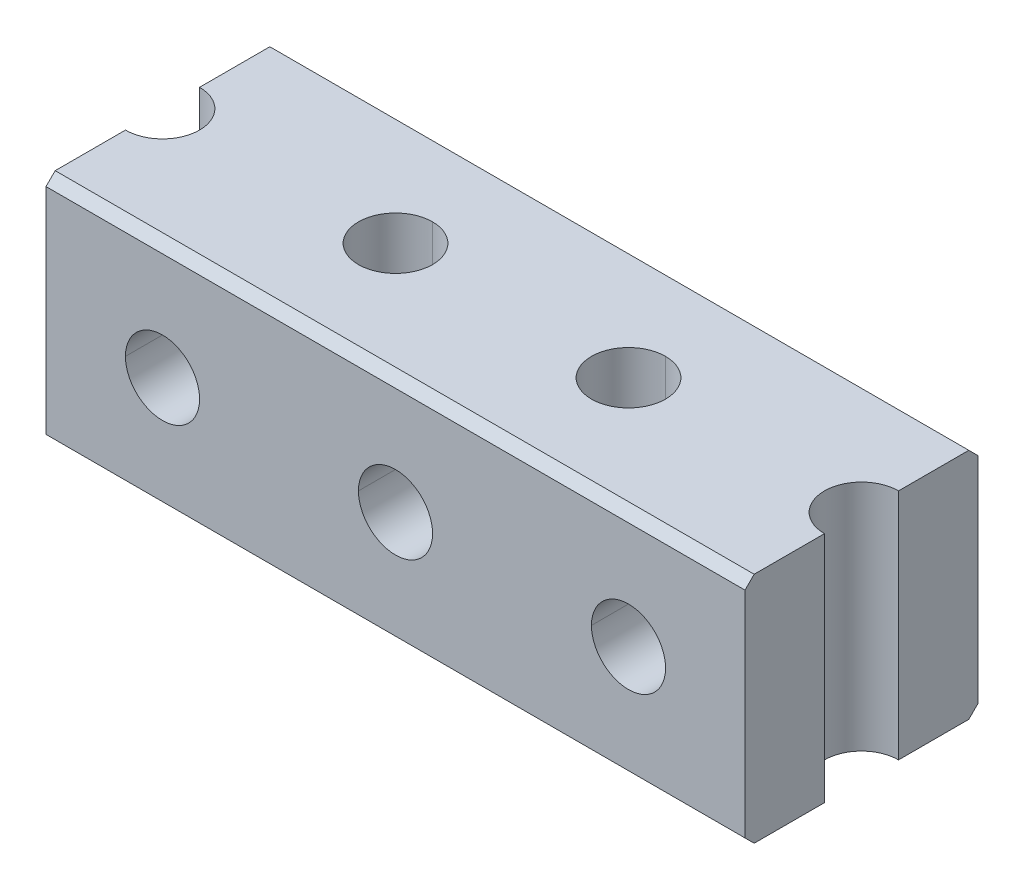
ISO-10303-21;
HEADER;
FILE_DESCRIPTION(('STEP AP214'),'2;1');
FILE_NAME('part.step','',(''),(''),'','','');
FILE_SCHEMA(('AUTOMOTIVE_DESIGN { 1 0 10303 214 1 1 1 1 }'));
ENDSEC;
DATA;
#1=APPLICATION_CONTEXT('core data for automotive mechanical design processes');
#2=APPLICATION_PROTOCOL_DEFINITION('international standard','automotive_design',2000,#1);
#3=PRODUCT_CONTEXT('',#1,'mechanical');
#4=PRODUCT('Part','Part','',(#3));
#5=PRODUCT_RELATED_PRODUCT_CATEGORY('part','',(#4));
#6=PRODUCT_DEFINITION_FORMATION('','',#4);
#7=PRODUCT_DEFINITION_CONTEXT('part definition',#1,'design');
#8=PRODUCT_DEFINITION('design','',#6,#7);
#9=PRODUCT_DEFINITION_SHAPE('','',#8);
#10=(LENGTH_UNIT() NAMED_UNIT(*) SI_UNIT(.MILLI.,.METRE.));
#11=(NAMED_UNIT(*) PLANE_ANGLE_UNIT() SI_UNIT($,.RADIAN.));
#12=(NAMED_UNIT(*) SI_UNIT($,.STERADIAN.) SOLID_ANGLE_UNIT());
#13=UNCERTAINTY_MEASURE_WITH_UNIT(LENGTH_MEASURE(1.E-05),#10,'distance_accuracy_value','');
#14=(GEOMETRIC_REPRESENTATION_CONTEXT(3) GLOBAL_UNCERTAINTY_ASSIGNED_CONTEXT((#13)) GLOBAL_UNIT_ASSIGNED_CONTEXT((#10,
#11,#12)) REPRESENTATION_CONTEXT('',''));
#15=CARTESIAN_POINT('',(0.,0.,0.));
#16=DIRECTION('',(0.,0.,1.));
#17=DIRECTION('',(1.,0.,0.));
#18=AXIS2_PLACEMENT_3D('',#15,#16,#17);
#19=CARTESIAN_POINT('',(-19.0500000000004,-6.3499999999999,1.11022302462516E-13));
#20=DIRECTION('',(1.,0.,0.));
#21=DIRECTION('',(0.,0.,-1.));
#22=AXIS2_PLACEMENT_3D('',#19,#20,#21);
#23=PLANE('',#22);
#24=DIRECTION('',(0.,-0.707106781186568,0.707106781186527));
#25=VECTOR('',#24,1.);
#26=CARTESIAN_POINT('',(-19.0500000000004,-5.85,-6.34999999999949));
#27=LINE('',#26,#25);
#28=CARTESIAN_POINT('',(-19.0500000000004,-5.85,-6.34999999999949));
#29=VERTEX_POINT('',#28);
#30=CARTESIAN_POINT('',(-19.0500000000004,-6.35,-5.84999999999952));
#31=VERTEX_POINT('',#30);
#32=EDGE_CURVE('E145',#29,#31,#27,.T.);
#33=ORIENTED_EDGE('',*,*,#32,.T.);
#34=DIRECTION('',(0.,0.,-1.));
#35=VECTOR('',#34,1.);
#36=CARTESIAN_POINT('',(-19.0500000000004,-6.3499999999999,1.11022302462516E-13));
#37=LINE('',#36,#35);
#38=CARTESIAN_POINT('',(-19.0500000000004,-6.3499999999999,-2.01929999999968));
#39=VERTEX_POINT('',#38);
#40=EDGE_CURVE('E167',#39,#31,#37,.T.);
#41=ORIENTED_EDGE('',*,*,#40,.F.);
#42=DIRECTION('',(0.,1.,0.));
#43=VECTOR('',#42,1.);
#44=CARTESIAN_POINT('',(-19.0500000000004,-6.3499999999999,-2.01929999999968));
#45=LINE('',#44,#43);
#46=CARTESIAN_POINT('',(-19.05,6.35000000000016,-2.01929999999981));
#47=VERTEX_POINT('',#46);
#48=EDGE_CURVE('E27',#39,#47,#45,.T.);
#49=ORIENTED_EDGE('',*,*,#48,.T.);
#50=DIRECTION('',(0.,0.,-1.));
#51=VECTOR('',#50,1.);
#52=CARTESIAN_POINT('',(-19.05,6.35000000000014,1.56125112837912E-13));
#53=LINE('',#52,#51);
#54=CARTESIAN_POINT('',(-19.05,6.35,-5.8499999999995));
#55=VERTEX_POINT('',#54);
#56=EDGE_CURVE('E221',#47,#55,#53,.T.);
#57=ORIENTED_EDGE('',*,*,#56,.T.);
#58=DIRECTION('',(0.,-0.707106781186568,-0.707106781186527));
#59=VECTOR('',#58,1.);
#60=CARTESIAN_POINT('',(-19.05,6.35,-5.8499999999995));
#61=LINE('',#60,#59);
#62=CARTESIAN_POINT('',(-19.0500000000002,5.85,-6.3499999999995));
#63=VERTEX_POINT('',#62);
#64=EDGE_CURVE('E250',#55,#63,#61,.T.);
#65=ORIENTED_EDGE('',*,*,#64,.T.);
#66=DIRECTION('',(0.,1.,0.));
#67=VECTOR('',#66,1.);
#68=CARTESIAN_POINT('',(-19.0500000000004,-6.35,-6.34999999999949));
#69=LINE('',#68,#67);
#70=EDGE_CURVE('E186',#29,#63,#69,.T.);
#71=ORIENTED_EDGE('',*,*,#70,.F.);
#72=EDGE_LOOP('',(#33,#41,#49,#57,#65,#71));
#73=FACE_BOUND('',#72,.T.);
#74=ADVANCED_FACE('F17',(#73),#23,.F.);
#75=CARTESIAN_POINT('',(19.05,-6.35000000000017,0.));
#76=DIRECTION('',(1.,0.,0.));
#77=DIRECTION('',(0.,0.,-1.));
#78=AXIS2_PLACEMENT_3D('',#75,#76,#77);
#79=PLANE('',#78);
#80=DIRECTION('',(0.,1.,0.));
#81=VECTOR('',#80,1.);
#82=CARTESIAN_POINT('',(19.05,-6.35000000000019,-6.34999999999954));
#83=LINE('',#82,#81);
#84=CARTESIAN_POINT('',(19.05,-5.85000000000016,-6.34999999999955));
#85=VERTEX_POINT('',#84);
#86=CARTESIAN_POINT('',(19.0500000000012,5.85000000000012,-6.34999999999965));
#87=VERTEX_POINT('',#86);
#88=EDGE_CURVE('E245',#85,#87,#83,.T.);
#89=ORIENTED_EDGE('',*,*,#88,.T.);
#90=DIRECTION('',(0.,-0.707106781186568,-0.707106781186527));
#91=VECTOR('',#90,1.);
#92=CARTESIAN_POINT('',(19.0500000000011,6.35000000000025,-5.84999999999972));
#93=LINE('',#92,#91);
#94=CARTESIAN_POINT('',(19.0500000000011,6.35000000000025,-5.84999999999972));
#95=VERTEX_POINT('',#94);
#96=EDGE_CURVE('E253',#95,#87,#93,.T.);
#97=ORIENTED_EDGE('',*,*,#96,.F.);
#98=DIRECTION('',(0.,0.,-1.));
#99=VECTOR('',#98,1.);
#100=CARTESIAN_POINT('',(19.0500000000011,6.35000000000025,1.17961196366423E-13));
#101=LINE('',#100,#99);
#102=CARTESIAN_POINT('',(19.0500000000011,6.35000000000027,-2.01929999999981));
#103=VERTEX_POINT('',#102);
#104=EDGE_CURVE('E140',#103,#95,#101,.T.);
#105=ORIENTED_EDGE('',*,*,#104,.F.);
#106=DIRECTION('',(0.,1.,0.));
#107=VECTOR('',#106,1.);
#108=CARTESIAN_POINT('',(19.05,-6.35000000000015,-2.01929999999983));
#109=LINE('',#108,#107);
#110=CARTESIAN_POINT('',(19.05,-6.35000000000015,-2.01929999999983));
#111=VERTEX_POINT('',#110);
#112=EDGE_CURVE('E130',#111,#103,#109,.T.);
#113=ORIENTED_EDGE('',*,*,#112,.F.);
#114=DIRECTION('',(0.,0.,-1.));
#115=VECTOR('',#114,1.);
#116=CARTESIAN_POINT('',(19.05,-6.35000000000017,0.));
#117=LINE('',#116,#115);
#118=CARTESIAN_POINT('',(19.05,-6.35000000000015,-5.84999999999971));
#119=VERTEX_POINT('',#118);
#120=EDGE_CURVE('E136',#111,#119,#117,.T.);
#121=ORIENTED_EDGE('',*,*,#120,.T.);
#122=DIRECTION('',(0.,-0.707106781186568,0.707106781186527));
#123=VECTOR('',#122,1.);
#124=CARTESIAN_POINT('',(19.05,-5.85000000000016,-6.34999999999955));
#125=LINE('',#124,#123);
#126=EDGE_CURVE('E224',#85,#119,#125,.T.);
#127=ORIENTED_EDGE('',*,*,#126,.F.);
#128=EDGE_LOOP('',(#89,#97,#105,#113,#121,#127));
#129=FACE_BOUND('',#128,.T.);
#130=ADVANCED_FACE('F133',(#129),#79,.T.);
#131=CARTESIAN_POINT('',(-19.0500000000004,-6.3499999999999,1.11022302462516E-13));
#132=DIRECTION('',(1.,0.,0.));
#133=DIRECTION('',(0.,0.,-1.));
#134=AXIS2_PLACEMENT_3D('',#131,#132,#133);
#135=PLANE('',#134);
#136=DIRECTION('',(0.,0.707106781186568,0.707106781186527));
#137=VECTOR('',#136,1.);
#138=CARTESIAN_POINT('',(-19.0500000000004,-6.34999999999993,5.85));
#139=LINE('',#138,#137);
#140=CARTESIAN_POINT('',(-19.0500000000004,-6.34999999999993,5.85));
#141=VERTEX_POINT('',#140);
#142=CARTESIAN_POINT('',(-19.0500000000004,-5.84999999999984,6.34999999999992));
#143=VERTEX_POINT('',#142);
#144=EDGE_CURVE('E41',#141,#143,#139,.T.);
#145=ORIENTED_EDGE('',*,*,#144,.T.);
#146=DIRECTION('',(0.,1.,0.));
#147=VECTOR('',#146,1.);
#148=CARTESIAN_POINT('',(-19.0500000000004,-6.34999999999987,6.34999999999992));
#149=LINE('',#148,#147);
#150=CARTESIAN_POINT('',(-19.0500000000002,5.85000000000026,6.35));
#151=VERTEX_POINT('',#150);
#152=EDGE_CURVE('E235',#143,#151,#149,.T.);
#153=ORIENTED_EDGE('',*,*,#152,.T.);
#154=DIRECTION('',(0.,0.707106781186568,-0.707106781186527));
#155=VECTOR('',#154,1.);
#156=CARTESIAN_POINT('',(-19.0500000000002,5.85000000000026,6.35));
#157=LINE('',#156,#155);
#158=CARTESIAN_POINT('',(-19.05,6.35000000000027,5.85));
#159=VERTEX_POINT('',#158);
#160=EDGE_CURVE('E198',#151,#159,#157,.T.);
#161=ORIENTED_EDGE('',*,*,#160,.T.);
#162=DIRECTION('',(0.,0.,-1.));
#163=VECTOR('',#162,1.);
#164=CARTESIAN_POINT('',(-19.05,6.35000000000014,1.56125112837912E-13));
#165=LINE('',#164,#163);
#166=CARTESIAN_POINT('',(-19.05,6.35000000000012,2.0193));
#167=VERTEX_POINT('',#166);
#168=EDGE_CURVE('E241',#159,#167,#165,.T.);
#169=ORIENTED_EDGE('',*,*,#168,.T.);
#170=DIRECTION('',(0.,1.,0.));
#171=VECTOR('',#170,1.);
#172=CARTESIAN_POINT('',(-19.0500000000004,-6.34999999999993,2.01930000000005));
#173=LINE('',#172,#171);
#174=CARTESIAN_POINT('',(-19.0500000000004,-6.34999999999993,2.01930000000005));
#175=VERTEX_POINT('',#174);
#176=EDGE_CURVE('E11',#175,#167,#173,.T.);
#177=ORIENTED_EDGE('',*,*,#176,.F.);
#178=DIRECTION('',(0.,0.,-1.));
#179=VECTOR('',#178,1.);
#180=CARTESIAN_POINT('',(-19.0500000000004,-6.3499999999999,1.11022302462516E-13));
#181=LINE('',#180,#179);
#182=EDGE_CURVE('E170',#141,#175,#181,.T.);
#183=ORIENTED_EDGE('',*,*,#182,.F.);
#184=EDGE_LOOP('',(#145,#153,#161,#169,#177,#183));
#185=FACE_BOUND('',#184,.T.);
#186=ADVANCED_FACE('F636',(#185),#135,.F.);
#187=CARTESIAN_POINT('',(19.05,-6.35000000000017,0.));
#188=DIRECTION('',(1.,0.,0.));
#189=DIRECTION('',(0.,0.,-1.));
#190=AXIS2_PLACEMENT_3D('',#187,#188,#189);
#191=PLANE('',#190);
#192=DIRECTION('',(0.,0.,-1.));
#193=VECTOR('',#192,1.);
#194=CARTESIAN_POINT('',(19.05,-6.35000000000017,0.));
#195=LINE('',#194,#193);
#196=CARTESIAN_POINT('',(19.05,-6.35000000000011,5.85));
#197=VERTEX_POINT('',#196);
#198=CARTESIAN_POINT('',(19.05,-6.35000000000018,2.01930000000003));
#199=VERTEX_POINT('',#198);
#200=EDGE_CURVE('E154',#197,#199,#195,.T.);
#201=ORIENTED_EDGE('',*,*,#200,.T.);
#202=DIRECTION('',(0.,1.,0.));
#203=VECTOR('',#202,1.);
#204=CARTESIAN_POINT('',(19.05,-6.35000000000018,2.01930000000003));
#205=LINE('',#204,#203);
#206=CARTESIAN_POINT('',(19.0500000000011,6.35000000000024,2.01929999999992));
#207=VERTEX_POINT('',#206);
#208=EDGE_CURVE('E146',#199,#207,#205,.T.);
#209=ORIENTED_EDGE('',*,*,#208,.T.);
#210=DIRECTION('',(0.,0.,-1.));
#211=VECTOR('',#210,1.);
#212=CARTESIAN_POINT('',(19.0500000000011,6.35000000000025,1.17961196366423E-13));
#213=LINE('',#212,#211);
#214=CARTESIAN_POINT('',(19.0500000000011,6.35000000000034,5.85));
#215=VERTEX_POINT('',#214);
#216=EDGE_CURVE('E332',#215,#207,#213,.T.);
#217=ORIENTED_EDGE('',*,*,#216,.F.);
#218=DIRECTION('',(0.,0.707106781186568,-0.707106781186527));
#219=VECTOR('',#218,1.);
#220=CARTESIAN_POINT('',(19.0500000000012,5.85000000000034,6.34999999999991));
#221=LINE('',#220,#219);
#222=CARTESIAN_POINT('',(19.0500000000012,5.85000000000034,6.34999999999991));
#223=VERTEX_POINT('',#222);
#224=EDGE_CURVE('E194',#223,#215,#221,.T.);
#225=ORIENTED_EDGE('',*,*,#224,.F.);
#226=DIRECTION('',(0.,1.,0.));
#227=VECTOR('',#226,1.);
#228=CARTESIAN_POINT('',(19.05,-6.35000000000007,6.35));
#229=LINE('',#228,#227);
#230=CARTESIAN_POINT('',(19.05,-5.85,6.34999999999992));
#231=VERTEX_POINT('',#230);
#232=EDGE_CURVE('E216',#231,#223,#229,.T.);
#233=ORIENTED_EDGE('',*,*,#232,.F.);
#234=DIRECTION('',(0.,0.707106781186568,0.707106781186527));
#235=VECTOR('',#234,1.);
#236=CARTESIAN_POINT('',(19.05,-6.35000000000011,5.85));
#237=LINE('',#236,#235);
#238=EDGE_CURVE('E55',#197,#231,#237,.T.);
#239=ORIENTED_EDGE('',*,*,#238,.F.);
#240=EDGE_LOOP('',(#201,#209,#217,#225,#233,#239));
#241=FACE_BOUND('',#240,.T.);
#242=ADVANCED_FACE('F19',(#241),#191,.T.);
#243=CARTESIAN_POINT('',(-19.05,6.35000000000014,1.56125112837912E-13));
#244=DIRECTION('',(0.,1.,0.));
#245=DIRECTION('',(0.,0.,1.));
#246=AXIS2_PLACEMENT_3D('',#243,#244,#245);
#247=CYLINDRICAL_SURFACE('',#246,2.01929999999991);
#248=CARTESIAN_POINT('',(-19.05,6.35000000000015,1.56125112837912E-13));
#249=DIRECTION('',(0.,1.,0.));
#250=DIRECTION('',(0.,0.,1.));
#251=AXIS2_PLACEMENT_3D('',#248,#249,#250);
#252=CIRCLE('',#251,2.0192999999999);
#253=EDGE_CURVE('E237',#167,#47,#252,.T.);
#254=ORIENTED_EDGE('',*,*,#253,.T.);
#255=ORIENTED_EDGE('',*,*,#48,.F.);
#256=CARTESIAN_POINT('',(-19.0500000000004,-6.3499999999999,1.11022302462516E-13));
#257=DIRECTION('',(0.,1.,0.));
#258=DIRECTION('',(0.,0.,1.));
#259=AXIS2_PLACEMENT_3D('',#256,#257,#258);
#260=CIRCLE('',#259,2.01929999999992);
#261=EDGE_CURVE('E178',#175,#39,#260,.T.);
#262=ORIENTED_EDGE('',*,*,#261,.F.);
#263=ORIENTED_EDGE('',*,*,#176,.T.);
#264=EDGE_LOOP('',(#254,#255,#262,#263));
#265=FACE_BOUND('',#264,.T.);
#266=ADVANCED_FACE('F428',(#265),#247,.F.);
#267=CARTESIAN_POINT('',(6.35000000000088,6.35000000000014,1.7347234759768E-13));
#268=DIRECTION('',(0.,1.,0.));
#269=DIRECTION('',(0.,0.,1.));
#270=AXIS2_PLACEMENT_3D('',#267,#268,#269);
#271=CYLINDRICAL_SURFACE('',#270,2.0192999999999);
#272=DIRECTION('',(0.,1.,0.));
#273=VECTOR('',#272,1.);
#274=CARTESIAN_POINT('',(6.35000000000088,6.35000000000014,-2.01929999999973));
#275=LINE('',#274,#273);
#276=CARTESIAN_POINT('',(6.35000000000088,-6.35000000000009,-2.01929999999991));
#277=VERTEX_POINT('',#276);
#278=CARTESIAN_POINT('',(6.35000000000088,6.35000000000014,-2.01929999999981));
#279=VERTEX_POINT('',#278);
#280=EDGE_CURVE('E206',#277,#279,#275,.T.);
#281=ORIENTED_EDGE('',*,*,#280,.F.);
#282=CARTESIAN_POINT('',(6.35,-6.35000000000009,0.));
#283=DIRECTION('',(0.,1.,0.));
#284=DIRECTION('',(0.,0.,1.));
#285=AXIS2_PLACEMENT_3D('',#282,#283,#284);
#286=CIRCLE('',#285,2.01929999999991);
#287=CARTESIAN_POINT('',(6.35,-6.35000000000009,2.0193));
#288=VERTEX_POINT('',#287);
#289=EDGE_CURVE('E274',#288,#277,#286,.T.);
#290=ORIENTED_EDGE('',*,*,#289,.F.);
#291=DIRECTION('',(0.,1.,0.));
#292=VECTOR('',#291,1.);
#293=CARTESIAN_POINT('',(6.35000000000088,6.35000000000014,2.01930000000008));
#294=LINE('',#293,#292);
#295=CARTESIAN_POINT('',(6.35000000000088,6.35000000000014,2.01930000000007));
#296=VERTEX_POINT('',#295);
#297=EDGE_CURVE('E205',#288,#296,#294,.T.);
#298=ORIENTED_EDGE('',*,*,#297,.T.);
#299=CARTESIAN_POINT('',(6.35000000000088,6.35000000000014,1.7347234759768E-13));
#300=DIRECTION('',(0.,1.,0.));
#301=DIRECTION('',(0.,0.,1.));
#302=AXIS2_PLACEMENT_3D('',#299,#300,#301);
#303=CIRCLE('',#302,2.0192999999999);
#304=EDGE_CURVE('E236',#296,#279,#303,.T.);
#305=ORIENTED_EDGE('',*,*,#304,.T.);
#306=EDGE_LOOP('',(#281,#290,#298,#305));
#307=FACE_BOUND('',#306,.T.);
#308=ADVANCED_FACE('F666',(#307),#271,.F.);
#309=CARTESIAN_POINT('',(-12.7000000000002,0.,6.34999999999992));
#310=DIRECTION('',(0.,0.,1.));
#311=DIRECTION('',(1.,0.,0.));
#312=AXIS2_PLACEMENT_3D('',#309,#310,#311);
#313=CYLINDRICAL_SURFACE('',#312,2.01930000000005);
#314=DIRECTION('',(0.,0.,1.));
#315=VECTOR('',#314,1.);
#316=CARTESIAN_POINT('',(-14.7193000000002,0.,6.34999999999992));
#317=LINE('',#316,#315);
#318=CARTESIAN_POINT('',(-14.7193000000002,0.,-6.34999999999955));
#319=VERTEX_POINT('',#318);
#320=CARTESIAN_POINT('',(-14.7193000000002,0.,6.34999999999992));
#321=VERTEX_POINT('',#320);
#322=EDGE_CURVE('E230',#319,#321,#317,.T.);
#323=ORIENTED_EDGE('',*,*,#322,.F.);
#324=CARTESIAN_POINT('',(-12.7000000000002,0.,-6.34999999999955));
#325=DIRECTION('',(0.,0.,1.));
#326=DIRECTION('',(1.,0.,0.));
#327=AXIS2_PLACEMENT_3D('',#324,#325,#326);
#328=CIRCLE('',#327,2.01930000000005);
#329=CARTESIAN_POINT('',(-10.6807,0.,-6.34999999999955));
#330=VERTEX_POINT('',#329);
#331=EDGE_CURVE('E177',#330,#319,#328,.T.);
#332=ORIENTED_EDGE('',*,*,#331,.F.);
#333=DIRECTION('',(0.,0.,1.));
#334=VECTOR('',#333,1.);
#335=CARTESIAN_POINT('',(-10.6807,0.,6.34999999999992));
#336=LINE('',#335,#334);
#337=CARTESIAN_POINT('',(-10.6807,0.,6.34999999999992));
#338=VERTEX_POINT('',#337);
#339=EDGE_CURVE('E229',#330,#338,#336,.T.);
#340=ORIENTED_EDGE('',*,*,#339,.T.);
#341=CARTESIAN_POINT('',(-12.7000000000002,0.,6.34999999999992));
#342=DIRECTION('',(0.,0.,1.));
#343=DIRECTION('',(1.,0.,0.));
#344=AXIS2_PLACEMENT_3D('',#341,#342,#343);
#345=CIRCLE('',#344,2.01930000000005);
#346=EDGE_CURVE('E180',#338,#321,#345,.T.);
#347=ORIENTED_EDGE('',*,*,#346,.T.);
#348=EDGE_LOOP('',(#323,#332,#340,#347));
#349=FACE_BOUND('',#348,.T.);
#350=ADVANCED_FACE('F318',(#349),#313,.F.);
#351=CARTESIAN_POINT('',(12.7000000000003,1.93421667571414E-13,6.35));
#352=DIRECTION('',(0.,0.,1.));
#353=DIRECTION('',(1.,0.,0.));
#354=AXIS2_PLACEMENT_3D('',#351,#352,#353);
#355=CYLINDRICAL_SURFACE('',#354,2.01930000000005);
#356=DIRECTION('',(0.,0.,1.));
#357=VECTOR('',#356,1.);
#358=CARTESIAN_POINT('',(10.6807000000003,1.93668960499566E-13,6.35));
#359=LINE('',#358,#357);
#360=CARTESIAN_POINT('',(10.6807,1.93668960499564E-13,-6.34999999999955));
#361=VERTEX_POINT('',#360);
#362=CARTESIAN_POINT('',(10.6807000000003,1.93668960499566E-13,6.35));
#363=VERTEX_POINT('',#362);
#364=EDGE_CURVE('E188',#361,#363,#359,.T.);
#365=ORIENTED_EDGE('',*,*,#364,.F.);
#366=CARTESIAN_POINT('',(12.7,2.08166817117217E-13,-6.34999999999955));
#367=DIRECTION('',(0.,0.,1.));
#368=DIRECTION('',(1.,0.,0.));
#369=AXIS2_PLACEMENT_3D('',#366,#367,#368);
#370=CIRCLE('',#369,2.01930000000005);
#371=CARTESIAN_POINT('',(14.7193,2.08166817117217E-13,-6.34999999999955));
#372=VERTEX_POINT('',#371);
#373=EDGE_CURVE('E173',#372,#361,#370,.T.);
#374=ORIENTED_EDGE('',*,*,#373,.F.);
#375=DIRECTION('',(0.,0.,1.));
#376=VECTOR('',#375,1.);
#377=CARTESIAN_POINT('',(14.7193000000004,1.93421667571414E-13,6.35));
#378=LINE('',#377,#376);
#379=CARTESIAN_POINT('',(14.7193000000004,1.93421667571414E-13,6.35));
#380=VERTEX_POINT('',#379);
#381=EDGE_CURVE('E246',#372,#380,#378,.T.);
#382=ORIENTED_EDGE('',*,*,#381,.T.);
#383=CARTESIAN_POINT('',(12.7000000000003,1.93421667571414E-13,6.35));
#384=DIRECTION('',(0.,0.,1.));
#385=DIRECTION('',(1.,0.,0.));
#386=AXIS2_PLACEMENT_3D('',#383,#384,#385);
#387=CIRCLE('',#386,2.01930000000005);
#388=EDGE_CURVE('E215',#380,#363,#387,.T.);
#389=ORIENTED_EDGE('',*,*,#388,.T.);
#390=EDGE_LOOP('',(#365,#374,#382,#389));
#391=FACE_BOUND('',#390,.T.);
#392=ADVANCED_FACE('F677',(#391),#355,.F.);
#393=CARTESIAN_POINT('',(-6.35000000000038,6.35,0.));
#394=DIRECTION('',(0.,1.,0.));
#395=DIRECTION('',(0.,0.,1.));
#396=AXIS2_PLACEMENT_3D('',#393,#394,#395);
#397=CYLINDRICAL_SURFACE('',#396,2.01929999999991);
#398=DIRECTION('',(0.,1.,0.));
#399=VECTOR('',#398,1.);
#400=CARTESIAN_POINT('',(-6.35000000000038,6.35,-2.01929999999996));
#401=LINE('',#400,#399);
#402=CARTESIAN_POINT('',(-6.35000000000038,-6.35000000000019,-2.01930000000008));
#403=VERTEX_POINT('',#402);
#404=CARTESIAN_POINT('',(-6.35000000000038,6.35,-2.01930000000005));
#405=VERTEX_POINT('',#404);
#406=EDGE_CURVE('E283',#403,#405,#401,.T.);
#407=ORIENTED_EDGE('',*,*,#406,.F.);
#408=CARTESIAN_POINT('',(-6.35000000000008,-6.35000000000019,0.));
#409=DIRECTION('',(0.,1.,0.));
#410=DIRECTION('',(0.,0.,1.));
#411=AXIS2_PLACEMENT_3D('',#408,#409,#410);
#412=CIRCLE('',#411,2.01929999999992);
#413=CARTESIAN_POINT('',(-6.35000000000008,-6.35000000000019,2.01929999999982));
#414=VERTEX_POINT('',#413);
#415=EDGE_CURVE('E282',#414,#403,#412,.T.);
#416=ORIENTED_EDGE('',*,*,#415,.F.);
#417=DIRECTION('',(0.,1.,0.));
#418=VECTOR('',#417,1.);
#419=CARTESIAN_POINT('',(-6.35000000000038,6.35,2.01929999999985));
#420=LINE('',#419,#418);
#421=CARTESIAN_POINT('',(-6.35000000000038,6.35,2.01929999999984));
#422=VERTEX_POINT('',#421);
#423=EDGE_CURVE('E290',#414,#422,#420,.T.);
#424=ORIENTED_EDGE('',*,*,#423,.T.);
#425=CARTESIAN_POINT('',(-6.35000000000038,6.35,0.));
#426=DIRECTION('',(0.,1.,0.));
#427=DIRECTION('',(0.,0.,1.));
#428=AXIS2_PLACEMENT_3D('',#425,#426,#427);
#429=CIRCLE('',#428,2.0192999999999);
#430=EDGE_CURVE('E336',#422,#405,#429,.T.);
#431=ORIENTED_EDGE('',*,*,#430,.T.);
#432=EDGE_LOOP('',(#407,#416,#424,#431));
#433=FACE_BOUND('',#432,.T.);
#434=ADVANCED_FACE('F690',(#433),#397,.F.);
#435=CARTESIAN_POINT('',(-1.11022302462516E-13,0.,6.34999999999991));
#436=DIRECTION('',(0.,0.,1.));
#437=DIRECTION('',(1.,0.,0.));
#438=AXIS2_PLACEMENT_3D('',#435,#436,#437);
#439=CYLINDRICAL_SURFACE('',#438,2.01930000000005);
#440=DIRECTION('',(0.,0.,1.));
#441=VECTOR('',#440,1.);
#442=CARTESIAN_POINT('',(-2.01930000000016,0.,6.34999999999991));
#443=LINE('',#442,#441);
#444=CARTESIAN_POINT('',(-2.0193,0.,-6.34999999999954));
#445=VERTEX_POINT('',#444);
#446=CARTESIAN_POINT('',(-2.01930000000011,0.,6.34999999999991));
#447=VERTEX_POINT('',#446);
#448=EDGE_CURVE('E1041',#445,#447,#443,.T.);
#449=ORIENTED_EDGE('',*,*,#448,.F.);
#450=CARTESIAN_POINT('',(0.,0.,-6.34999999999954));
#451=DIRECTION('',(0.,0.,1.));
#452=DIRECTION('',(1.,0.,0.));
#453=AXIS2_PLACEMENT_3D('',#450,#451,#452);
#454=CIRCLE('',#453,2.01930000000005);
#455=CARTESIAN_POINT('',(2.01930000000005,0.,-6.34999999999954));
#456=VERTEX_POINT('',#455);
#457=EDGE_CURVE('E21',#456,#445,#454,.T.);
#458=ORIENTED_EDGE('',*,*,#457,.F.);
#459=DIRECTION('',(0.,0.,1.));
#460=VECTOR('',#459,1.);
#461=CARTESIAN_POINT('',(2.01929999999994,0.,6.34999999999991));
#462=LINE('',#461,#460);
#463=CARTESIAN_POINT('',(2.01929999999994,0.,6.34999999999991));
#464=VERTEX_POINT('',#463);
#465=EDGE_CURVE('E187',#456,#464,#462,.T.);
#466=ORIENTED_EDGE('',*,*,#465,.T.);
#467=CARTESIAN_POINT('',(-1.11022302462516E-13,0.,6.34999999999991));
#468=DIRECTION('',(0.,0.,1.));
#469=DIRECTION('',(1.,0.,0.));
#470=AXIS2_PLACEMENT_3D('',#467,#468,#469);
#471=CIRCLE('',#470,2.01930000000005);
#472=EDGE_CURVE('E211',#464,#447,#471,.T.);
#473=ORIENTED_EDGE('',*,*,#472,.T.);
#474=EDGE_LOOP('',(#449,#458,#466,#473));
#475=FACE_BOUND('',#474,.T.);
#476=ADVANCED_FACE('F685',(#475),#439,.F.);
#477=CARTESIAN_POINT('',(76.2000000000015,5.85000000000034,6.35));
#478=DIRECTION('',(0.,-0.707106781186568,-0.707106781186527));
#479=DIRECTION('',(0.,0.707106781186527,-0.707106781186568));
#480=AXIS2_PLACEMENT_3D('',#477,#478,#479);
#481=PLANE('',#480);
#482=ORIENTED_EDGE('',*,*,#160,.F.);
#483=DIRECTION('',(-1.,0.,0.));
#484=VECTOR('',#483,1.);
#485=CARTESIAN_POINT('',(76.2000000000015,5.85000000000034,6.35));
#486=LINE('',#485,#484);
#487=EDGE_CURVE('E231',#223,#151,#486,.T.);
#488=ORIENTED_EDGE('',*,*,#487,.F.);
#489=ORIENTED_EDGE('',*,*,#224,.T.);
#490=DIRECTION('',(1.,0.,0.));
#491=VECTOR('',#490,1.);
#492=CARTESIAN_POINT('',(76.2000000000021,6.35000000000036,5.85));
#493=LINE('',#492,#491);
#494=EDGE_CURVE('E1034',#159,#215,#493,.T.);
#495=ORIENTED_EDGE('',*,*,#494,.F.);
#496=EDGE_LOOP('',(#482,#488,#489,#495));
#497=FACE_BOUND('',#496,.T.);
#498=ADVANCED_FACE('F689',(#497),#481,.F.);
#499=CARTESIAN_POINT('',(76.2000000000021,6.35000000000018,-5.84999999999974));
#500=DIRECTION('',(0.,-0.707106781186568,0.707106781186527));
#501=DIRECTION('',(-1.,0.,0.));
#502=AXIS2_PLACEMENT_3D('',#499,#500,#501);
#503=PLANE('',#502);
#504=ORIENTED_EDGE('',*,*,#64,.F.);
#505=DIRECTION('',(-1.,0.,0.));
#506=VECTOR('',#505,1.);
#507=CARTESIAN_POINT('',(76.2000000000021,6.35000000000018,-5.84999999999974));
#508=LINE('',#507,#506);
#509=EDGE_CURVE('E217',#95,#55,#508,.T.);
#510=ORIENTED_EDGE('',*,*,#509,.F.);
#511=ORIENTED_EDGE('',*,*,#96,.T.);
#512=DIRECTION('',(1.,0.,0.));
#513=VECTOR('',#512,1.);
#514=CARTESIAN_POINT('',(76.2000000000019,5.84999999999991,-6.34999999999956));
#515=LINE('',#514,#513);
#516=EDGE_CURVE('E210',#63,#87,#515,.T.);
#517=ORIENTED_EDGE('',*,*,#516,.F.);
#518=EDGE_LOOP('',(#504,#510,#511,#517));
#519=FACE_BOUND('',#518,.T.);
#520=ADVANCED_FACE('F433',(#519),#503,.F.);
#521=CARTESIAN_POINT('',(76.200000000002,-6.3500000000001,5.85000000000019));
#522=DIRECTION('',(0.,0.707106781186568,-0.707106781186527));
#523=DIRECTION('',(-1.,0.,0.));
#524=AXIS2_PLACEMENT_3D('',#521,#522,#523);
#525=PLANE('',#524);
#526=ORIENTED_EDGE('',*,*,#144,.F.);
#527=DIRECTION('',(-1.,0.,0.));
#528=VECTOR('',#527,1.);
#529=CARTESIAN_POINT('',(76.200000000002,-6.3500000000001,5.85000000000019));
#530=LINE('',#529,#528);
#531=EDGE_CURVE('E342',#197,#141,#530,.T.);
#532=ORIENTED_EDGE('',*,*,#531,.F.);
#533=ORIENTED_EDGE('',*,*,#238,.T.);
#534=DIRECTION('',(1.,0.,0.));
#535=VECTOR('',#534,1.);
#536=CARTESIAN_POINT('',(76.200000000002,-5.85,6.35000000000011));
#537=LINE('',#536,#535);
#538=EDGE_CURVE('E270',#143,#231,#537,.T.);
#539=ORIENTED_EDGE('',*,*,#538,.F.);
#540=EDGE_LOOP('',(#526,#532,#533,#539));
#541=FACE_BOUND('',#540,.T.);
#542=ADVANCED_FACE('F657',(#541),#525,.F.);
#543=CARTESIAN_POINT('',(76.200000000002,-5.85000000000021,-6.34999999999958));
#544=DIRECTION('',(0.,0.707106781186568,0.707106781186527));
#545=DIRECTION('',(1.,0.,0.));
#546=AXIS2_PLACEMENT_3D('',#543,#544,#545);
#547=PLANE('',#546);
#548=ORIENTED_EDGE('',*,*,#32,.F.);
#549=DIRECTION('',(-1.,0.,0.));
#550=VECTOR('',#549,1.);
#551=CARTESIAN_POINT('',(76.200000000002,-5.85000000000021,-6.34999999999958));
#552=LINE('',#551,#550);
#553=EDGE_CURVE('E182',#85,#29,#552,.T.);
#554=ORIENTED_EDGE('',*,*,#553,.F.);
#555=ORIENTED_EDGE('',*,*,#126,.T.);
#556=DIRECTION('',(1.,0.,0.));
#557=VECTOR('',#556,1.);
#558=CARTESIAN_POINT('',(76.200000000002,-6.35000000000028,-5.84999999999971));
#559=LINE('',#558,#557);
#560=EDGE_CURVE('E160',#31,#119,#559,.T.);
#561=ORIENTED_EDGE('',*,*,#560,.F.);
#562=EDGE_LOOP('',(#548,#554,#555,#561));
#563=FACE_BOUND('',#562,.T.);
#564=ADVANCED_FACE('F653',(#563),#547,.F.);
#565=CARTESIAN_POINT('',(19.0500000000011,6.35000000000025,1.17961196366423E-13));
#566=DIRECTION('',(0.,1.,0.));
#567=DIRECTION('',(0.,0.,1.));
#568=AXIS2_PLACEMENT_3D('',#565,#566,#567);
#569=CYLINDRICAL_SURFACE('',#568,2.01929999999991);
#570=ORIENTED_EDGE('',*,*,#208,.F.);
#571=CARTESIAN_POINT('',(19.05,-6.35000000000017,0.));
#572=DIRECTION('',(0.,1.,0.));
#573=DIRECTION('',(0.,0.,1.));
#574=AXIS2_PLACEMENT_3D('',#571,#572,#573);
#575=CIRCLE('',#574,2.01929999999992);
#576=EDGE_CURVE('E149',#111,#199,#575,.T.);
#577=ORIENTED_EDGE('',*,*,#576,.F.);
#578=ORIENTED_EDGE('',*,*,#112,.T.);
#579=CARTESIAN_POINT('',(19.0500000000011,6.35000000000025,1.17961196366423E-13));
#580=DIRECTION('',(0.,1.,0.));
#581=DIRECTION('',(0.,0.,1.));
#582=AXIS2_PLACEMENT_3D('',#579,#580,#581);
#583=CIRCLE('',#582,2.0192999999999);
#584=EDGE_CURVE('E337',#103,#207,#583,.T.);
#585=ORIENTED_EDGE('',*,*,#584,.T.);
#586=EDGE_LOOP('',(#570,#577,#578,#585));
#587=FACE_BOUND('',#586,.T.);
#588=ADVANCED_FACE('F150',(#587),#569,.F.);
#589=CARTESIAN_POINT('',(76.200000000002,-6.35,6.35000000000019));
#590=DIRECTION('',(0.,1.,0.));
#591=DIRECTION('',(0.,0.,-1.));
#592=AXIS2_PLACEMENT_3D('',#589,#590,#591);
#593=PLANE('',#592);
#594=ORIENTED_EDGE('',*,*,#289,.T.);
#595=CARTESIAN_POINT('',(6.35,-6.35000000000009,0.));
#596=DIRECTION('',(0.,1.,0.));
#597=DIRECTION('',(0.,0.,1.));
#598=AXIS2_PLACEMENT_3D('',#595,#596,#597);
#599=CIRCLE('',#598,2.01929999999991);
#600=EDGE_CURVE('E1113',#277,#288,#599,.T.);
#601=ORIENTED_EDGE('',*,*,#600,.T.);
#602=EDGE_LOOP('',(#594,#601));
#603=FACE_BOUND('',#602,.T.);
#604=ORIENTED_EDGE('',*,*,#415,.T.);
#605=CARTESIAN_POINT('',(-6.35000000000008,-6.35000000000019,0.));
#606=DIRECTION('',(0.,1.,0.));
#607=DIRECTION('',(0.,0.,1.));
#608=AXIS2_PLACEMENT_3D('',#605,#606,#607);
#609=CIRCLE('',#608,2.01929999999992);
#610=EDGE_CURVE('E249',#403,#414,#609,.T.);
#611=ORIENTED_EDGE('',*,*,#610,.T.);
#612=EDGE_LOOP('',(#604,#611));
#613=FACE_BOUND('',#612,.T.);
#614=ORIENTED_EDGE('',*,*,#261,.T.);
#615=ORIENTED_EDGE('',*,*,#40,.T.);
#616=ORIENTED_EDGE('',*,*,#560,.T.);
#617=ORIENTED_EDGE('',*,*,#120,.F.);
#618=ORIENTED_EDGE('',*,*,#576,.T.);
#619=ORIENTED_EDGE('',*,*,#200,.F.);
#620=ORIENTED_EDGE('',*,*,#531,.T.);
#621=ORIENTED_EDGE('',*,*,#182,.T.);
#622=EDGE_LOOP('',(#614,#615,#616,#617,#618,#619,#620,#621));
#623=FACE_BOUND('',#622,.T.);
#624=ADVANCED_FACE('F157',(#603,#613,#623),#593,.F.);
#625=CARTESIAN_POINT('',(76.2000000000021,6.35000000000034,6.35));
#626=DIRECTION('',(0.,0.,-1.));
#627=DIRECTION('',(-1.,0.,0.));
#628=AXIS2_PLACEMENT_3D('',#625,#626,#627);
#629=PLANE('',#628);
#630=ORIENTED_EDGE('',*,*,#346,.F.);
#631=CARTESIAN_POINT('',(-12.7000000000002,0.,6.34999999999992));
#632=DIRECTION('',(0.,0.,1.));
#633=DIRECTION('',(1.,0.,0.));
#634=AXIS2_PLACEMENT_3D('',#631,#632,#633);
#635=CIRCLE('',#634,2.01930000000005);
#636=EDGE_CURVE('E225',#321,#338,#635,.T.);
#637=ORIENTED_EDGE('',*,*,#636,.F.);
#638=EDGE_LOOP('',(#630,#637));
#639=FACE_BOUND('',#638,.T.);
#640=ORIENTED_EDGE('',*,*,#388,.F.);
#641=CARTESIAN_POINT('',(12.7000000000003,1.93421667571414E-13,6.35));
#642=DIRECTION('',(0.,0.,1.));
#643=DIRECTION('',(1.,0.,0.));
#644=AXIS2_PLACEMENT_3D('',#641,#642,#643);
#645=CIRCLE('',#644,2.01930000000005);
#646=EDGE_CURVE('E192',#363,#380,#645,.T.);
#647=ORIENTED_EDGE('',*,*,#646,.F.);
#648=EDGE_LOOP('',(#640,#647));
#649=FACE_BOUND('',#648,.T.);
#650=ORIENTED_EDGE('',*,*,#472,.F.);
#651=CARTESIAN_POINT('',(-1.11022302462516E-13,0.,6.34999999999991));
#652=DIRECTION('',(0.,0.,1.));
#653=DIRECTION('',(1.,0.,0.));
#654=AXIS2_PLACEMENT_3D('',#651,#652,#653);
#655=CIRCLE('',#654,2.01930000000005);
#656=EDGE_CURVE('E354',#447,#464,#655,.T.);
#657=ORIENTED_EDGE('',*,*,#656,.F.);
#658=EDGE_LOOP('',(#650,#657));
#659=FACE_BOUND('',#658,.T.);
#660=ORIENTED_EDGE('',*,*,#487,.T.);
#661=ORIENTED_EDGE('',*,*,#152,.F.);
#662=ORIENTED_EDGE('',*,*,#538,.T.);
#663=ORIENTED_EDGE('',*,*,#232,.T.);
#664=EDGE_LOOP('',(#660,#661,#662,#663));
#665=FACE_BOUND('',#664,.T.);
#666=ADVANCED_FACE('F745',(#639,#649,#659,#665),#629,.F.);
#667=CARTESIAN_POINT('',(76.2000000000021,6.35000000000034,6.35));
#668=DIRECTION('',(0.,-1.,0.));
#669=DIRECTION('',(-1.,0.,0.));
#670=AXIS2_PLACEMENT_3D('',#667,#668,#669);
#671=PLANE('',#670);
#672=ORIENTED_EDGE('',*,*,#304,.F.);
#673=CARTESIAN_POINT('',(6.35000000000088,6.35000000000014,1.7347234759768E-13));
#674=DIRECTION('',(0.,1.,0.));
#675=DIRECTION('',(0.,0.,1.));
#676=AXIS2_PLACEMENT_3D('',#673,#674,#675);
#677=CIRCLE('',#676,2.0192999999999);
#678=EDGE_CURVE('E201',#279,#296,#677,.T.);
#679=ORIENTED_EDGE('',*,*,#678,.F.);
#680=EDGE_LOOP('',(#672,#679));
#681=FACE_BOUND('',#680,.T.);
#682=ORIENTED_EDGE('',*,*,#430,.F.);
#683=CARTESIAN_POINT('',(-6.35000000000038,6.35,0.));
#684=DIRECTION('',(0.,1.,0.));
#685=DIRECTION('',(0.,0.,1.));
#686=AXIS2_PLACEMENT_3D('',#683,#684,#685);
#687=CIRCLE('',#686,2.0192999999999);
#688=EDGE_CURVE('E287',#405,#422,#687,.T.);
#689=ORIENTED_EDGE('',*,*,#688,.F.);
#690=EDGE_LOOP('',(#682,#689));
#691=FACE_BOUND('',#690,.T.);
#692=ORIENTED_EDGE('',*,*,#509,.T.);
#693=ORIENTED_EDGE('',*,*,#56,.F.);
#694=ORIENTED_EDGE('',*,*,#253,.F.);
#695=ORIENTED_EDGE('',*,*,#168,.F.);
#696=ORIENTED_EDGE('',*,*,#494,.T.);
#697=ORIENTED_EDGE('',*,*,#216,.T.);
#698=ORIENTED_EDGE('',*,*,#584,.F.);
#699=ORIENTED_EDGE('',*,*,#104,.T.);
#700=EDGE_LOOP('',(#692,#693,#694,#695,#696,#697,#698,#699));
#701=FACE_BOUND('',#700,.T.);
#702=ADVANCED_FACE('F369',(#681,#691,#701),#671,.F.);
#703=CARTESIAN_POINT('',(76.2000000000021,6.34999999999993,-6.34999999999962));
#704=DIRECTION('',(0.,0.,1.));
#705=DIRECTION('',(0.,-1.,0.));
#706=AXIS2_PLACEMENT_3D('',#703,#704,#705);
#707=PLANE('',#706);
#708=ORIENTED_EDGE('',*,*,#331,.T.);
#709=CARTESIAN_POINT('',(-12.7000000000002,0.,-6.34999999999955));
#710=DIRECTION('',(0.,0.,1.));
#711=DIRECTION('',(1.,0.,0.));
#712=AXIS2_PLACEMENT_3D('',#709,#710,#711);
#713=CIRCLE('',#712,2.01930000000005);
#714=EDGE_CURVE('E297',#319,#330,#713,.T.);
#715=ORIENTED_EDGE('',*,*,#714,.T.);
#716=EDGE_LOOP('',(#708,#715));
#717=FACE_BOUND('',#716,.T.);
#718=ORIENTED_EDGE('',*,*,#373,.T.);
#719=CARTESIAN_POINT('',(12.7,2.08166817117217E-13,-6.34999999999955));
#720=DIRECTION('',(0.,0.,1.));
#721=DIRECTION('',(1.,0.,0.));
#722=AXIS2_PLACEMENT_3D('',#719,#720,#721);
#723=CIRCLE('',#722,2.01930000000005);
#724=EDGE_CURVE('E193',#361,#372,#723,.T.);
#725=ORIENTED_EDGE('',*,*,#724,.T.);
#726=EDGE_LOOP('',(#718,#725));
#727=FACE_BOUND('',#726,.T.);
#728=ORIENTED_EDGE('',*,*,#457,.T.);
#729=CARTESIAN_POINT('',(0.,0.,-6.34999999999954));
#730=DIRECTION('',(0.,0.,1.));
#731=DIRECTION('',(1.,0.,0.));
#732=AXIS2_PLACEMENT_3D('',#729,#730,#731);
#733=CIRCLE('',#732,2.01930000000005);
#734=EDGE_CURVE('E294',#445,#456,#733,.T.);
#735=ORIENTED_EDGE('',*,*,#734,.T.);
#736=EDGE_LOOP('',(#728,#735));
#737=FACE_BOUND('',#736,.T.);
#738=ORIENTED_EDGE('',*,*,#553,.T.);
#739=ORIENTED_EDGE('',*,*,#70,.T.);
#740=ORIENTED_EDGE('',*,*,#516,.T.);
#741=ORIENTED_EDGE('',*,*,#88,.F.);
#742=EDGE_LOOP('',(#738,#739,#740,#741));
#743=FACE_BOUND('',#742,.T.);
#744=ADVANCED_FACE('F307',(#717,#727,#737,#743),#707,.F.);
#745=CARTESIAN_POINT('',(-1.11022302462516E-13,0.,6.34999999999991));
#746=DIRECTION('',(0.,0.,1.));
#747=DIRECTION('',(1.,0.,0.));
#748=AXIS2_PLACEMENT_3D('',#745,#746,#747);
#749=CYLINDRICAL_SURFACE('',#748,2.01930000000005);
#750=ORIENTED_EDGE('',*,*,#734,.F.);
#751=ORIENTED_EDGE('',*,*,#448,.T.);
#752=ORIENTED_EDGE('',*,*,#656,.T.);
#753=ORIENTED_EDGE('',*,*,#465,.F.);
#754=EDGE_LOOP('',(#750,#751,#752,#753));
#755=FACE_BOUND('',#754,.T.);
#756=ADVANCED_FACE('F640',(#755),#749,.F.);
#757=CARTESIAN_POINT('',(-6.35000000000038,6.35,0.));
#758=DIRECTION('',(0.,1.,0.));
#759=DIRECTION('',(0.,0.,1.));
#760=AXIS2_PLACEMENT_3D('',#757,#758,#759);
#761=CYLINDRICAL_SURFACE('',#760,2.01929999999991);
#762=ORIENTED_EDGE('',*,*,#610,.F.);
#763=ORIENTED_EDGE('',*,*,#406,.T.);
#764=ORIENTED_EDGE('',*,*,#688,.T.);
#765=ORIENTED_EDGE('',*,*,#423,.F.);
#766=EDGE_LOOP('',(#762,#763,#764,#765));
#767=FACE_BOUND('',#766,.T.);
#768=ADVANCED_FACE('F365',(#767),#761,.F.);
#769=CARTESIAN_POINT('',(12.7000000000003,1.93421667571414E-13,6.35));
#770=DIRECTION('',(0.,0.,1.));
#771=DIRECTION('',(1.,0.,0.));
#772=AXIS2_PLACEMENT_3D('',#769,#770,#771);
#773=CYLINDRICAL_SURFACE('',#772,2.01930000000005);
#774=ORIENTED_EDGE('',*,*,#724,.F.);
#775=ORIENTED_EDGE('',*,*,#364,.T.);
#776=ORIENTED_EDGE('',*,*,#646,.T.);
#777=ORIENTED_EDGE('',*,*,#381,.F.);
#778=EDGE_LOOP('',(#774,#775,#776,#777));
#779=FACE_BOUND('',#778,.T.);
#780=ADVANCED_FACE('F806',(#779),#773,.F.);
#781=CARTESIAN_POINT('',(-12.7000000000002,0.,6.34999999999992));
#782=DIRECTION('',(0.,0.,1.));
#783=DIRECTION('',(1.,0.,0.));
#784=AXIS2_PLACEMENT_3D('',#781,#782,#783);
#785=CYLINDRICAL_SURFACE('',#784,2.01930000000005);
#786=ORIENTED_EDGE('',*,*,#714,.F.);
#787=ORIENTED_EDGE('',*,*,#322,.T.);
#788=ORIENTED_EDGE('',*,*,#636,.T.);
#789=ORIENTED_EDGE('',*,*,#339,.F.);
#790=EDGE_LOOP('',(#786,#787,#788,#789));
#791=FACE_BOUND('',#790,.T.);
#792=ADVANCED_FACE('F325',(#791),#785,.F.);
#793=CARTESIAN_POINT('',(6.35000000000088,6.35000000000014,1.7347234759768E-13));
#794=DIRECTION('',(0.,1.,0.));
#795=DIRECTION('',(0.,0.,1.));
#796=AXIS2_PLACEMENT_3D('',#793,#794,#795);
#797=CYLINDRICAL_SURFACE('',#796,2.0192999999999);
#798=ORIENTED_EDGE('',*,*,#600,.F.);
#799=ORIENTED_EDGE('',*,*,#280,.T.);
#800=ORIENTED_EDGE('',*,*,#678,.T.);
#801=ORIENTED_EDGE('',*,*,#297,.F.);
#802=EDGE_LOOP('',(#798,#799,#800,#801));
#803=FACE_BOUND('',#802,.T.);
#804=ADVANCED_FACE('F766',(#803),#797,.F.);
#805=CLOSED_SHELL('',(#74,#130,#186,#242,#266,#308,#350,#392,#434,#476,#498,#520,#542,#564,#588,
#624,#666,#702,#744,#756,#768,#780,#792,#804));
#806=MANIFOLD_SOLID_BREP('B1',#805);
#807=ADVANCED_BREP_SHAPE_REPRESENTATION('',(#18,#806),#14);
#808=SHAPE_DEFINITION_REPRESENTATION(#9,#807);
ENDSEC;
END-ISO-10303-21;
